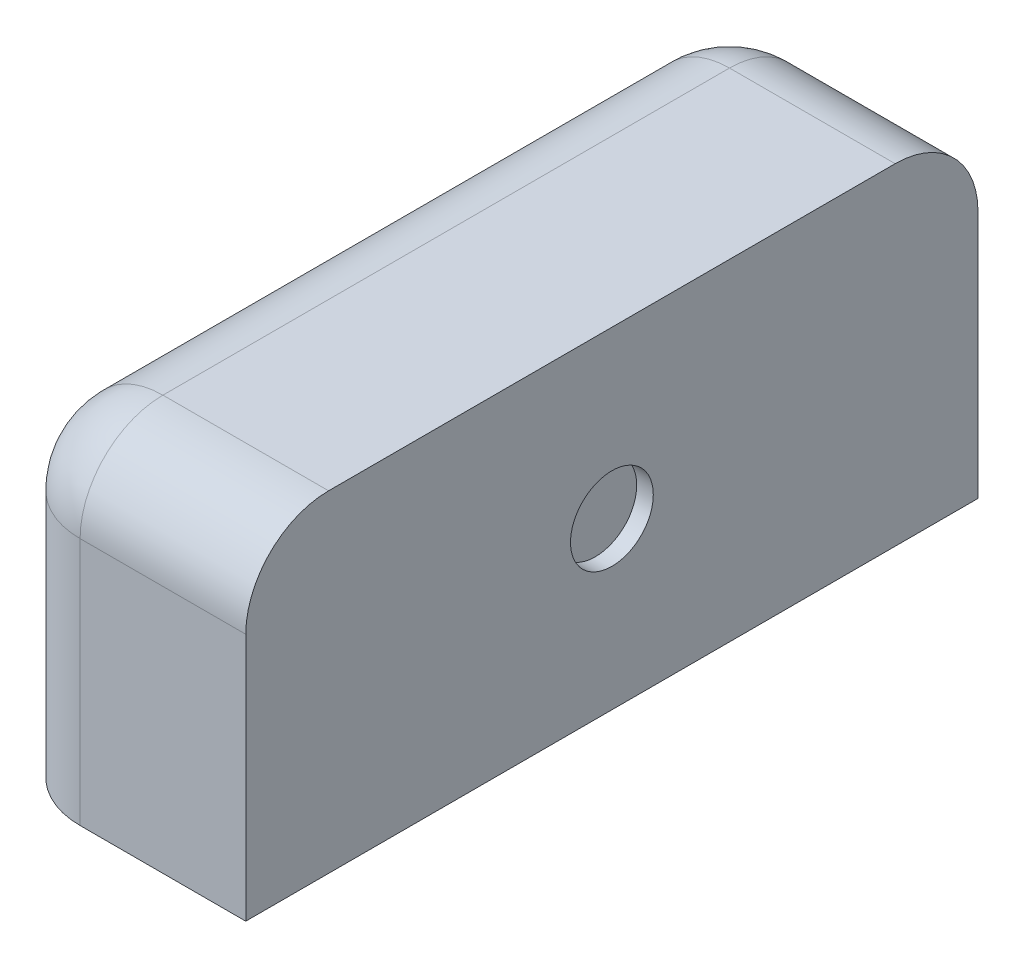
ISO-10303-21;
HEADER;
FILE_DESCRIPTION(('STEP AP214'),'2;1');
FILE_NAME('part.step','',(''),(''),'','','');
FILE_SCHEMA(('AUTOMOTIVE_DESIGN { 1 0 10303 214 1 1 1 1 }'));
ENDSEC;
DATA;
#1=APPLICATION_CONTEXT('core data for automotive mechanical design processes');
#2=APPLICATION_PROTOCOL_DEFINITION('international standard','automotive_design',2000,#1);
#3=PRODUCT_CONTEXT('',#1,'mechanical');
#4=PRODUCT('Part','Part','',(#3));
#5=PRODUCT_RELATED_PRODUCT_CATEGORY('part','',(#4));
#6=PRODUCT_DEFINITION_FORMATION('','',#4);
#7=PRODUCT_DEFINITION_CONTEXT('part definition',#1,'design');
#8=PRODUCT_DEFINITION('design','',#6,#7);
#9=PRODUCT_DEFINITION_SHAPE('','',#8);
#10=(LENGTH_UNIT() NAMED_UNIT(*) SI_UNIT(.MILLI.,.METRE.));
#11=(NAMED_UNIT(*) PLANE_ANGLE_UNIT() SI_UNIT($,.RADIAN.));
#12=(NAMED_UNIT(*) SI_UNIT($,.STERADIAN.) SOLID_ANGLE_UNIT());
#13=UNCERTAINTY_MEASURE_WITH_UNIT(LENGTH_MEASURE(1.E-05),#10,'distance_accuracy_value','');
#14=(GEOMETRIC_REPRESENTATION_CONTEXT(3) GLOBAL_UNCERTAINTY_ASSIGNED_CONTEXT((#13)) GLOBAL_UNIT_ASSIGNED_CONTEXT((#10,
#11,#12)) REPRESENTATION_CONTEXT('',''));
#15=CARTESIAN_POINT('',(0.,0.,0.));
#16=DIRECTION('',(0.,0.,1.));
#17=DIRECTION('',(1.,0.,0.));
#18=AXIS2_PLACEMENT_3D('',#15,#16,#17);
#19=CARTESIAN_POINT('',(0.,40.,0.));
#20=DIRECTION('',(1.,0.,0.));
#21=DIRECTION('',(0.,0.,-1.));
#22=AXIS2_PLACEMENT_3D('',#19,#20,#21);
#23=PLANE('',#22);
#24=DIRECTION('',(0.,0.,1.));
#25=VECTOR('',#24,1.);
#26=CARTESIAN_POINT('',(0.,30.,0.));
#27=LINE('',#26,#25);
#28=CARTESIAN_POINT('',(0.,30.,-10.));
#29=VERTEX_POINT('',#28);
#30=CARTESIAN_POINT('',(0.,30.,-78.4));
#31=VERTEX_POINT('',#30);
#32=EDGE_CURVE('E57',#29,#31,#27,.F.);
#33=ORIENTED_EDGE('',*,*,#32,.T.);
#34=DIRECTION('',(0.,-1.,0.));
#35=VECTOR('',#34,1.);
#36=CARTESIAN_POINT('',(0.,40.,-78.4));
#37=LINE('',#36,#35);
#38=CARTESIAN_POINT('',(0.,0.,-78.4));
#39=VERTEX_POINT('',#38);
#40=EDGE_CURVE('E174',#31,#39,#37,.T.);
#41=ORIENTED_EDGE('',*,*,#40,.T.);
#42=DIRECTION('',(0.,0.,1.));
#43=VECTOR('',#42,1.);
#44=CARTESIAN_POINT('',(0.,0.,0.));
#45=LINE('',#44,#43);
#46=CARTESIAN_POINT('',(0.,0.,-10.));
#47=VERTEX_POINT('',#46);
#48=EDGE_CURVE('E118',#39,#47,#45,.T.);
#49=ORIENTED_EDGE('',*,*,#48,.T.);
#50=DIRECTION('',(0.,-1.,0.));
#51=VECTOR('',#50,1.);
#52=CARTESIAN_POINT('',(0.,40.,-10.));
#53=LINE('',#52,#51);
#54=EDGE_CURVE('E62',#47,#29,#53,.F.);
#55=ORIENTED_EDGE('',*,*,#54,.T.);
#56=EDGE_LOOP('',(#33,#41,#49,#55));
#57=FACE_BOUND('',#56,.T.);
#58=ADVANCED_FACE('F39',(#57),#23,.F.);
#59=CARTESIAN_POINT('',(0.,40.,0.));
#60=DIRECTION('',(0.,0.,-1.));
#61=DIRECTION('',(-1.,0.,0.));
#62=AXIS2_PLACEMENT_3D('',#59,#60,#61);
#63=PLANE('',#62);
#64=DIRECTION('',(0.,-1.,0.));
#65=VECTOR('',#64,1.);
#66=CARTESIAN_POINT('',(30.,40.,0.));
#67=LINE('',#66,#65);
#68=CARTESIAN_POINT('',(30.,30.,0.));
#69=VERTEX_POINT('',#68);
#70=CARTESIAN_POINT('',(30.,0.,0.));
#71=VERTEX_POINT('',#70);
#72=EDGE_CURVE('E109',#69,#71,#67,.T.);
#73=ORIENTED_EDGE('',*,*,#72,.F.);
#74=DIRECTION('',(1.,0.,0.));
#75=VECTOR('',#74,1.);
#76=CARTESIAN_POINT('',(0.,30.,0.));
#77=LINE('',#76,#75);
#78=CARTESIAN_POINT('',(10.,30.,0.));
#79=VERTEX_POINT('',#78);
#80=EDGE_CURVE('E167',#69,#79,#77,.F.);
#81=ORIENTED_EDGE('',*,*,#80,.T.);
#82=DIRECTION('',(0.,-1.,0.));
#83=VECTOR('',#82,1.);
#84=CARTESIAN_POINT('',(10.,40.,0.));
#85=LINE('',#84,#83);
#86=CARTESIAN_POINT('',(10.,0.,0.));
#87=VERTEX_POINT('',#86);
#88=EDGE_CURVE('E112',#79,#87,#85,.T.);
#89=ORIENTED_EDGE('',*,*,#88,.T.);
#90=DIRECTION('',(1.,0.,0.));
#91=VECTOR('',#90,1.);
#92=CARTESIAN_POINT('',(0.,0.,0.));
#93=LINE('',#92,#91);
#94=EDGE_CURVE('E106',#87,#71,#93,.T.);
#95=ORIENTED_EDGE('',*,*,#94,.T.);
#96=EDGE_LOOP('',(#73,#81,#89,#95));
#97=FACE_BOUND('',#96,.T.);
#98=ADVANCED_FACE('F108',(#97),#63,.F.);
#99=CARTESIAN_POINT('',(30.,40.,0.));
#100=DIRECTION('',(-1.,0.,0.));
#101=DIRECTION('',(0.,0.,1.));
#102=AXIS2_PLACEMENT_3D('',#99,#100,#101);
#103=PLANE('',#102);
#104=CARTESIAN_POINT('',(30.,20.,-44.2));
#105=DIRECTION('',(1.,0.,0.));
#106=DIRECTION('',(0.,0.,-1.));
#107=AXIS2_PLACEMENT_3D('',#104,#105,#106);
#108=CIRCLE('',#107,5.);
#109=CARTESIAN_POINT('',(30.,20.,-49.2));
#110=VERTEX_POINT('',#109);
#111=EDGE_CURVE('E207',#110,#110,#108,.T.);
#112=ORIENTED_EDGE('',*,*,#111,.F.);
#113=EDGE_LOOP('',(#112));
#114=FACE_BOUND('',#113,.T.);
#115=DIRECTION('',(0.,-1.,0.));
#116=VECTOR('',#115,1.);
#117=CARTESIAN_POINT('',(30.,40.,-88.4));
#118=LINE('',#117,#116);
#119=CARTESIAN_POINT('',(30.,30.,-88.4));
#120=VERTEX_POINT('',#119);
#121=CARTESIAN_POINT('',(30.,0.,-88.4));
#122=VERTEX_POINT('',#121);
#123=EDGE_CURVE('E130',#120,#122,#118,.T.);
#124=ORIENTED_EDGE('',*,*,#123,.F.);
#125=CARTESIAN_POINT('',(30.,30.,-78.4));
#126=DIRECTION('',(-1.,0.,0.));
#127=DIRECTION('',(0.,0.,1.));
#128=AXIS2_PLACEMENT_3D('',#125,#126,#127);
#129=CIRCLE('',#128,10.);
#130=CARTESIAN_POINT('',(30.,40.,-78.4));
#131=VERTEX_POINT('',#130);
#132=EDGE_CURVE('E162',#120,#131,#129,.F.);
#133=ORIENTED_EDGE('',*,*,#132,.T.);
#134=DIRECTION('',(0.,0.,-1.));
#135=VECTOR('',#134,1.);
#136=CARTESIAN_POINT('',(30.,40.,0.));
#137=LINE('',#136,#135);
#138=CARTESIAN_POINT('',(30.,40.,-10.));
#139=VERTEX_POINT('',#138);
#140=EDGE_CURVE('E139',#139,#131,#137,.T.);
#141=ORIENTED_EDGE('',*,*,#140,.F.);
#142=CARTESIAN_POINT('',(30.,30.,-10.));
#143=DIRECTION('',(-1.,0.,0.));
#144=DIRECTION('',(0.,0.,1.));
#145=AXIS2_PLACEMENT_3D('',#142,#143,#144);
#146=CIRCLE('',#145,10.);
#147=EDGE_CURVE('E127',#139,#69,#146,.F.);
#148=ORIENTED_EDGE('',*,*,#147,.T.);
#149=ORIENTED_EDGE('',*,*,#72,.T.);
#150=DIRECTION('',(0.,0.,-1.));
#151=VECTOR('',#150,1.);
#152=CARTESIAN_POINT('',(30.,0.,0.));
#153=LINE('',#152,#151);
#154=EDGE_CURVE('E117',#71,#122,#153,.T.);
#155=ORIENTED_EDGE('',*,*,#154,.T.);
#156=EDGE_LOOP('',(#124,#133,#141,#148,#149,#155));
#157=FACE_BOUND('',#156,.T.);
#158=ADVANCED_FACE('F123',(#114,#157),#103,.F.);
#159=CARTESIAN_POINT('',(0.,40.,-88.4));
#160=DIRECTION('',(0.,0.,1.));
#161=DIRECTION('',(1.,0.,0.));
#162=AXIS2_PLACEMENT_3D('',#159,#160,#161);
#163=PLANE('',#162);
#164=DIRECTION('',(0.,-1.,0.));
#165=VECTOR('',#164,1.);
#166=CARTESIAN_POINT('',(10.,40.,-88.4));
#167=LINE('',#166,#165);
#168=CARTESIAN_POINT('',(10.,0.,-88.4));
#169=VERTEX_POINT('',#168);
#170=CARTESIAN_POINT('',(10.,30.,-88.4));
#171=VERTEX_POINT('',#170);
#172=EDGE_CURVE('E154',#169,#171,#167,.F.);
#173=ORIENTED_EDGE('',*,*,#172,.T.);
#174=DIRECTION('',(-1.,0.,0.));
#175=VECTOR('',#174,1.);
#176=CARTESIAN_POINT('',(0.,30.,-88.4));
#177=LINE('',#176,#175);
#178=EDGE_CURVE('E157',#171,#120,#177,.F.);
#179=ORIENTED_EDGE('',*,*,#178,.T.);
#180=ORIENTED_EDGE('',*,*,#123,.T.);
#181=DIRECTION('',(-1.,0.,0.));
#182=VECTOR('',#181,1.);
#183=CARTESIAN_POINT('',(0.,0.,-88.4));
#184=LINE('',#183,#182);
#185=EDGE_CURVE('E135',#122,#169,#184,.T.);
#186=ORIENTED_EDGE('',*,*,#185,.T.);
#187=EDGE_LOOP('',(#173,#179,#180,#186));
#188=FACE_BOUND('',#187,.T.);
#189=ADVANCED_FACE('F225',(#188),#163,.F.);
#190=CARTESIAN_POINT('',(0.,40.,0.));
#191=DIRECTION('',(0.,-1.,0.));
#192=DIRECTION('',(0.,0.,-1.));
#193=AXIS2_PLACEMENT_3D('',#190,#191,#192);
#194=PLANE('',#193);
#195=ORIENTED_EDGE('',*,*,#140,.T.);
#196=DIRECTION('',(-1.,0.,0.));
#197=VECTOR('',#196,1.);
#198=CARTESIAN_POINT('',(0.,40.,-78.4));
#199=LINE('',#198,#197);
#200=CARTESIAN_POINT('',(10.,40.,-78.4));
#201=VERTEX_POINT('',#200);
#202=EDGE_CURVE('E150',#131,#201,#199,.T.);
#203=ORIENTED_EDGE('',*,*,#202,.T.);
#204=DIRECTION('',(0.,0.,1.));
#205=VECTOR('',#204,1.);
#206=CARTESIAN_POINT('',(10.,40.,0.));
#207=LINE('',#206,#205);
#208=CARTESIAN_POINT('',(10.,40.,-10.));
#209=VERTEX_POINT('',#208);
#210=EDGE_CURVE('E129',#201,#209,#207,.T.);
#211=ORIENTED_EDGE('',*,*,#210,.T.);
#212=DIRECTION('',(1.,0.,0.));
#213=VECTOR('',#212,1.);
#214=CARTESIAN_POINT('',(0.,40.,-10.));
#215=LINE('',#214,#213);
#216=EDGE_CURVE('E147',#209,#139,#215,.T.);
#217=ORIENTED_EDGE('',*,*,#216,.T.);
#218=EDGE_LOOP('',(#195,#203,#211,#217));
#219=FACE_BOUND('',#218,.T.);
#220=ADVANCED_FACE('F231',(#219),#194,.F.);
#221=CARTESIAN_POINT('',(0.,0.,0.));
#222=DIRECTION('',(0.,-1.,0.));
#223=DIRECTION('',(0.,0.,-1.));
#224=AXIS2_PLACEMENT_3D('',#221,#222,#223);
#225=PLANE('',#224);
#226=ORIENTED_EDGE('',*,*,#48,.F.);
#227=CARTESIAN_POINT('',(10.,0.,-78.4));
#228=DIRECTION('',(0.,-1.,0.));
#229=DIRECTION('',(0.,0.,-1.));
#230=AXIS2_PLACEMENT_3D('',#227,#228,#229);
#231=CIRCLE('',#230,10.);
#232=EDGE_CURVE('E11',#39,#169,#231,.T.);
#233=ORIENTED_EDGE('',*,*,#232,.T.);
#234=ORIENTED_EDGE('',*,*,#185,.F.);
#235=ORIENTED_EDGE('',*,*,#154,.F.);
#236=ORIENTED_EDGE('',*,*,#94,.F.);
#237=CARTESIAN_POINT('',(10.,0.,-10.));
#238=DIRECTION('',(0.,-1.,0.));
#239=DIRECTION('',(0.,0.,-1.));
#240=AXIS2_PLACEMENT_3D('',#237,#238,#239);
#241=CIRCLE('',#240,10.);
#242=EDGE_CURVE('E49',#87,#47,#241,.T.);
#243=ORIENTED_EDGE('',*,*,#242,.T.);
#244=EDGE_LOOP('',(#226,#233,#234,#235,#236,#243));
#245=FACE_BOUND('',#244,.T.);
#246=ADVANCED_FACE('F133',(#245),#225,.T.);
#247=CARTESIAN_POINT('',(0.,30.,-10.));
#248=DIRECTION('',(1.,0.,0.));
#249=DIRECTION('',(0.,0.,-1.));
#250=AXIS2_PLACEMENT_3D('',#247,#248,#249);
#251=CYLINDRICAL_SURFACE('',#250,10.);
#252=ORIENTED_EDGE('',*,*,#147,.F.);
#253=ORIENTED_EDGE('',*,*,#216,.F.);
#254=CARTESIAN_POINT('',(10.,30.,-10.));
#255=DIRECTION('',(-1.,0.,0.));
#256=DIRECTION('',(0.,0.,1.));
#257=AXIS2_PLACEMENT_3D('',#254,#255,#256);
#258=CIRCLE('',#257,10.);
#259=EDGE_CURVE('E43',#79,#209,#258,.T.);
#260=ORIENTED_EDGE('',*,*,#259,.F.);
#261=ORIENTED_EDGE('',*,*,#80,.F.);
#262=EDGE_LOOP('',(#252,#253,#260,#261));
#263=FACE_BOUND('',#262,.T.);
#264=ADVANCED_FACE('F41',(#263),#251,.T.);
#265=CARTESIAN_POINT('',(10.,40.,-10.));
#266=DIRECTION('',(0.,-1.,0.));
#267=DIRECTION('',(0.,0.,-1.));
#268=AXIS2_PLACEMENT_3D('',#265,#266,#267);
#269=CYLINDRICAL_SURFACE('',#268,10.);
#270=ORIENTED_EDGE('',*,*,#242,.F.);
#271=ORIENTED_EDGE('',*,*,#88,.F.);
#272=CARTESIAN_POINT('',(10.,30.,-10.));
#273=DIRECTION('',(0.,1.,0.));
#274=DIRECTION('',(0.,0.,1.));
#275=AXIS2_PLACEMENT_3D('',#272,#273,#274);
#276=CIRCLE('',#275,10.);
#277=EDGE_CURVE('E194',#29,#79,#276,.T.);
#278=ORIENTED_EDGE('',*,*,#277,.F.);
#279=ORIENTED_EDGE('',*,*,#54,.F.);
#280=EDGE_LOOP('',(#270,#271,#278,#279));
#281=FACE_BOUND('',#280,.T.);
#282=ADVANCED_FACE('F257',(#281),#269,.T.);
#283=CARTESIAN_POINT('',(10.,30.,-10.));
#284=DIRECTION('',(0.,0.,1.));
#285=DIRECTION('',(1.,0.,0.));
#286=AXIS2_PLACEMENT_3D('',#283,#284,#285);
#287=SPHERICAL_SURFACE('',#286,10.);
#288=ORIENTED_EDGE('',*,*,#277,.T.);
#289=ORIENTED_EDGE('',*,*,#259,.T.);
#290=CARTESIAN_POINT('',(10.,30.,-10.));
#291=DIRECTION('',(0.,0.,1.));
#292=DIRECTION('',(1.,0.,0.));
#293=AXIS2_PLACEMENT_3D('',#290,#291,#292);
#294=CIRCLE('',#293,10.);
#295=EDGE_CURVE('E191',#29,#209,#294,.F.);
#296=ORIENTED_EDGE('',*,*,#295,.F.);
#297=EDGE_LOOP('',(#288,#289,#296));
#298=FACE_BOUND('',#297,.T.);
#299=ADVANCED_FACE('F254',(#298),#287,.T.);
#300=CARTESIAN_POINT('',(10.,30.,0.));
#301=DIRECTION('',(0.,0.,1.));
#302=DIRECTION('',(1.,0.,0.));
#303=AXIS2_PLACEMENT_3D('',#300,#301,#302);
#304=CYLINDRICAL_SURFACE('',#303,10.);
#305=ORIENTED_EDGE('',*,*,#295,.T.);
#306=ORIENTED_EDGE('',*,*,#210,.F.);
#307=CARTESIAN_POINT('',(10.,30.,-78.4));
#308=DIRECTION('',(0.,0.,-1.));
#309=DIRECTION('',(-1.,0.,0.));
#310=AXIS2_PLACEMENT_3D('',#307,#308,#309);
#311=CIRCLE('',#310,10.);
#312=EDGE_CURVE('E187',#31,#201,#311,.T.);
#313=ORIENTED_EDGE('',*,*,#312,.F.);
#314=ORIENTED_EDGE('',*,*,#32,.F.);
#315=EDGE_LOOP('',(#305,#306,#313,#314));
#316=FACE_BOUND('',#315,.T.);
#317=ADVANCED_FACE('F250',(#316),#304,.T.);
#318=CARTESIAN_POINT('',(10.,40.,-78.4));
#319=DIRECTION('',(0.,-1.,0.));
#320=DIRECTION('',(0.,0.,-1.));
#321=AXIS2_PLACEMENT_3D('',#318,#319,#320);
#322=CYLINDRICAL_SURFACE('',#321,10.);
#323=ORIENTED_EDGE('',*,*,#232,.F.);
#324=ORIENTED_EDGE('',*,*,#40,.F.);
#325=CARTESIAN_POINT('',(10.,30.,-78.4));
#326=DIRECTION('',(0.,1.,0.));
#327=DIRECTION('',(0.,0.,1.));
#328=AXIS2_PLACEMENT_3D('',#325,#326,#327);
#329=CIRCLE('',#328,10.);
#330=EDGE_CURVE('E182',#171,#31,#329,.T.);
#331=ORIENTED_EDGE('',*,*,#330,.F.);
#332=ORIENTED_EDGE('',*,*,#172,.F.);
#333=EDGE_LOOP('',(#323,#324,#331,#332));
#334=FACE_BOUND('',#333,.T.);
#335=ADVANCED_FACE('F246',(#334),#322,.T.);
#336=CARTESIAN_POINT('',(10.,30.,-78.4));
#337=DIRECTION('',(-1.,0.,0.));
#338=DIRECTION('',(0.,0.,1.));
#339=AXIS2_PLACEMENT_3D('',#336,#337,#338);
#340=SPHERICAL_SURFACE('',#339,10.);
#341=ORIENTED_EDGE('',*,*,#330,.T.);
#342=ORIENTED_EDGE('',*,*,#312,.T.);
#343=CARTESIAN_POINT('',(10.,30.,-78.4));
#344=DIRECTION('',(-1.,0.,0.));
#345=DIRECTION('',(0.,0.,1.));
#346=AXIS2_PLACEMENT_3D('',#343,#344,#345);
#347=CIRCLE('',#346,10.);
#348=EDGE_CURVE('E179',#171,#201,#347,.F.);
#349=ORIENTED_EDGE('',*,*,#348,.F.);
#350=EDGE_LOOP('',(#341,#342,#349));
#351=FACE_BOUND('',#350,.T.);
#352=ADVANCED_FACE('F242',(#351),#340,.T.);
#353=CARTESIAN_POINT('',(0.,30.,-78.4));
#354=DIRECTION('',(-1.,0.,0.));
#355=DIRECTION('',(0.,0.,1.));
#356=AXIS2_PLACEMENT_3D('',#353,#354,#355);
#357=CYLINDRICAL_SURFACE('',#356,10.);
#358=ORIENTED_EDGE('',*,*,#132,.F.);
#359=ORIENTED_EDGE('',*,*,#178,.F.);
#360=ORIENTED_EDGE('',*,*,#348,.T.);
#361=ORIENTED_EDGE('',*,*,#202,.F.);
#362=EDGE_LOOP('',(#358,#359,#360,#361));
#363=FACE_BOUND('',#362,.T.);
#364=ADVANCED_FACE('F220',(#363),#357,.T.);
#365=CARTESIAN_POINT('',(28.,20.,-44.2));
#366=DIRECTION('',(1.,0.,0.));
#367=DIRECTION('',(0.,0.,-1.));
#368=AXIS2_PLACEMENT_3D('',#365,#366,#367);
#369=CYLINDRICAL_SURFACE('',#368,5.);
#370=CARTESIAN_POINT('',(28.,20.,-44.2));
#371=DIRECTION('',(1.,0.,0.));
#372=DIRECTION('',(0.,0.,-1.));
#373=AXIS2_PLACEMENT_3D('',#370,#371,#372);
#374=CIRCLE('',#373,5.);
#375=CARTESIAN_POINT('',(28.,20.,-49.2));
#376=VERTEX_POINT('',#375);
#377=EDGE_CURVE('E183',#376,#376,#374,.T.);
#378=ORIENTED_EDGE('',*,*,#377,.F.);
#379=EDGE_LOOP('',(#378));
#380=FACE_BOUND('',#379,.T.);
#381=ORIENTED_EDGE('',*,*,#111,.T.);
#382=EDGE_LOOP('',(#381));
#383=FACE_BOUND('',#382,.T.);
#384=ADVANCED_FACE('F217',(#380,#383),#369,.F.);
#385=CARTESIAN_POINT('',(28.,20.,-44.2));
#386=DIRECTION('',(1.,0.,0.));
#387=DIRECTION('',(0.,0.,-1.));
#388=AXIS2_PLACEMENT_3D('',#385,#386,#387);
#389=PLANE('',#388);
#390=ORIENTED_EDGE('',*,*,#377,.T.);
#391=EDGE_LOOP('',(#390));
#392=FACE_BOUND('',#391,.T.);
#393=ADVANCED_FACE('F215',(#392),#389,.T.);
#394=CLOSED_SHELL('',(#58,#98,#158,#189,#220,#246,#264,#282,#299,#317,#335,#352,#364,#384,#393));
#395=MANIFOLD_SOLID_BREP('B2',#394);
#396=ADVANCED_BREP_SHAPE_REPRESENTATION('',(#18,#395),#14);
#397=SHAPE_DEFINITION_REPRESENTATION(#9,#396);
ENDSEC;
END-ISO-10303-21;
